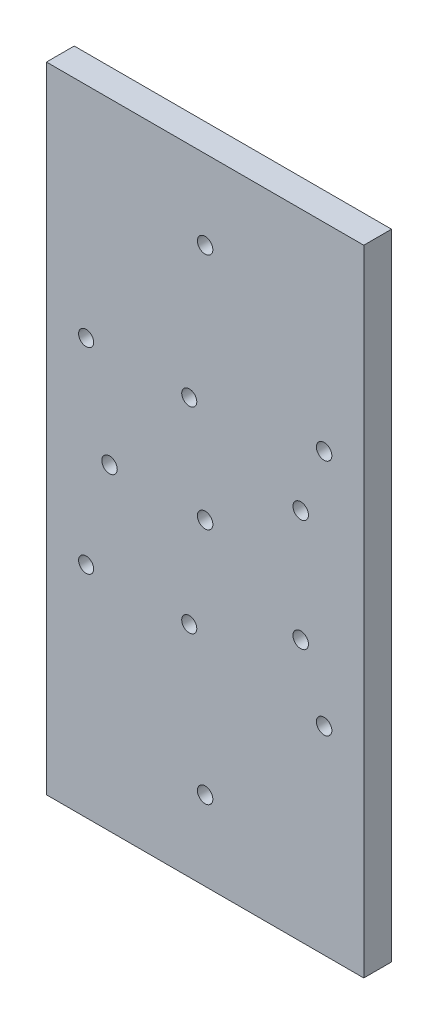
ISO-10303-21;
HEADER;
FILE_DESCRIPTION(('STEP AP214'),'2;1');
FILE_NAME('part.step','',(''),(''),'','','');
FILE_SCHEMA(('AUTOMOTIVE_DESIGN { 1 0 10303 214 1 1 1 1 }'));
ENDSEC;
DATA;
#1=APPLICATION_CONTEXT('core data for automotive mechanical design processes');
#2=APPLICATION_PROTOCOL_DEFINITION('international standard','automotive_design',2000,#1);
#3=PRODUCT_CONTEXT('',#1,'mechanical');
#4=PRODUCT('Part','Part','',(#3));
#5=PRODUCT_RELATED_PRODUCT_CATEGORY('part','',(#4));
#6=PRODUCT_DEFINITION_FORMATION('','',#4);
#7=PRODUCT_DEFINITION_CONTEXT('part definition',#1,'design');
#8=PRODUCT_DEFINITION('design','',#6,#7);
#9=PRODUCT_DEFINITION_SHAPE('','',#8);
#10=(LENGTH_UNIT() NAMED_UNIT(*) SI_UNIT(.MILLI.,.METRE.));
#11=(NAMED_UNIT(*) PLANE_ANGLE_UNIT() SI_UNIT($,.RADIAN.));
#12=(NAMED_UNIT(*) SI_UNIT($,.STERADIAN.) SOLID_ANGLE_UNIT());
#13=UNCERTAINTY_MEASURE_WITH_UNIT(LENGTH_MEASURE(1.E-05),#10,'distance_accuracy_value','');
#14=(GEOMETRIC_REPRESENTATION_CONTEXT(3) GLOBAL_UNCERTAINTY_ASSIGNED_CONTEXT((#13)) GLOBAL_UNIT_ASSIGNED_CONTEXT((#10,
#11,#12)) REPRESENTATION_CONTEXT('',''));
#15=CARTESIAN_POINT('',(0.,0.,0.));
#16=DIRECTION('',(0.,0.,1.));
#17=DIRECTION('',(1.,0.,0.));
#18=AXIS2_PLACEMENT_3D('',#15,#16,#17);
#19=CARTESIAN_POINT('',(40.,0.,7.));
#20=DIRECTION('',(-1.,0.,0.));
#21=DIRECTION('',(0.,0.,1.));
#22=AXIS2_PLACEMENT_3D('',#19,#20,#21);
#23=PLANE('',#22);
#24=DIRECTION('',(0.,1.,0.));
#25=VECTOR('',#24,1.);
#26=CARTESIAN_POINT('',(40.,0.,0.));
#27=LINE('',#26,#25);
#28=CARTESIAN_POINT('',(40.,-80.,0.));
#29=VERTEX_POINT('',#28);
#30=CARTESIAN_POINT('',(40.,80.,0.));
#31=VERTEX_POINT('',#30);
#32=EDGE_CURVE('E127',#29,#31,#27,.T.);
#33=ORIENTED_EDGE('',*,*,#32,.T.);
#34=DIRECTION('',(0.,0.,-1.));
#35=VECTOR('',#34,1.);
#36=CARTESIAN_POINT('',(40.,80.,7.));
#37=LINE('',#36,#35);
#38=CARTESIAN_POINT('',(40.,80.,7.));
#39=VERTEX_POINT('',#38);
#40=EDGE_CURVE('E11',#39,#31,#37,.T.);
#41=ORIENTED_EDGE('',*,*,#40,.F.);
#42=DIRECTION('',(0.,1.,0.));
#43=VECTOR('',#42,1.);
#44=CARTESIAN_POINT('',(40.,0.,7.));
#45=LINE('',#44,#43);
#46=CARTESIAN_POINT('',(40.,-80.,7.));
#47=VERTEX_POINT('',#46);
#48=EDGE_CURVE('E87',#47,#39,#45,.T.);
#49=ORIENTED_EDGE('',*,*,#48,.F.);
#50=DIRECTION('',(0.,0.,-1.));
#51=VECTOR('',#50,1.);
#52=CARTESIAN_POINT('',(40.,-80.,7.));
#53=LINE('',#52,#51);
#54=EDGE_CURVE('E107',#47,#29,#53,.T.);
#55=ORIENTED_EDGE('',*,*,#54,.T.);
#56=EDGE_LOOP('',(#33,#41,#49,#55));
#57=FACE_BOUND('',#56,.T.);
#58=ADVANCED_FACE('F45',(#57),#23,.F.);
#59=CARTESIAN_POINT('',(0.,80.,7.));
#60=DIRECTION('',(0.,1.,0.));
#61=DIRECTION('',(0.,0.,1.));
#62=AXIS2_PLACEMENT_3D('',#59,#60,#61);
#63=PLANE('',#62);
#64=DIRECTION('',(1.,0.,0.));
#65=VECTOR('',#64,1.);
#66=CARTESIAN_POINT('',(0.,80.,0.));
#67=LINE('',#66,#65);
#68=CARTESIAN_POINT('',(-40.,80.,0.));
#69=VERTEX_POINT('',#68);
#70=EDGE_CURVE('E96',#69,#31,#67,.T.);
#71=ORIENTED_EDGE('',*,*,#70,.F.);
#72=DIRECTION('',(0.,0.,-1.));
#73=VECTOR('',#72,1.);
#74=CARTESIAN_POINT('',(-40.,80.,7.));
#75=LINE('',#74,#73);
#76=CARTESIAN_POINT('',(-40.,80.,7.));
#77=VERTEX_POINT('',#76);
#78=EDGE_CURVE('E55',#77,#69,#75,.T.);
#79=ORIENTED_EDGE('',*,*,#78,.F.);
#80=DIRECTION('',(1.,0.,0.));
#81=VECTOR('',#80,1.);
#82=CARTESIAN_POINT('',(0.,80.,7.));
#83=LINE('',#82,#81);
#84=EDGE_CURVE('E94',#77,#39,#83,.T.);
#85=ORIENTED_EDGE('',*,*,#84,.T.);
#86=ORIENTED_EDGE('',*,*,#40,.T.);
#87=EDGE_LOOP('',(#71,#79,#85,#86));
#88=FACE_BOUND('',#87,.T.);
#89=ADVANCED_FACE('F93',(#88),#63,.T.);
#90=CARTESIAN_POINT('',(-40.,0.,7.));
#91=DIRECTION('',(-1.,0.,0.));
#92=DIRECTION('',(0.,0.,1.));
#93=AXIS2_PLACEMENT_3D('',#90,#91,#92);
#94=PLANE('',#93);
#95=DIRECTION('',(0.,1.,0.));
#96=VECTOR('',#95,1.);
#97=CARTESIAN_POINT('',(-40.,0.,0.));
#98=LINE('',#97,#96);
#99=CARTESIAN_POINT('',(-40.,-80.,0.));
#100=VERTEX_POINT('',#99);
#101=EDGE_CURVE('E131',#100,#69,#98,.T.);
#102=ORIENTED_EDGE('',*,*,#101,.F.);
#103=DIRECTION('',(0.,0.,-1.));
#104=VECTOR('',#103,1.);
#105=CARTESIAN_POINT('',(-40.,-80.,7.));
#106=LINE('',#105,#104);
#107=CARTESIAN_POINT('',(-40.,-80.,7.));
#108=VERTEX_POINT('',#107);
#109=EDGE_CURVE('E79',#108,#100,#106,.T.);
#110=ORIENTED_EDGE('',*,*,#109,.F.);
#111=DIRECTION('',(0.,1.,0.));
#112=VECTOR('',#111,1.);
#113=CARTESIAN_POINT('',(-40.,0.,7.));
#114=LINE('',#113,#112);
#115=EDGE_CURVE('E103',#108,#77,#114,.T.);
#116=ORIENTED_EDGE('',*,*,#115,.T.);
#117=ORIENTED_EDGE('',*,*,#78,.T.);
#118=EDGE_LOOP('',(#102,#110,#116,#117));
#119=FACE_BOUND('',#118,.T.);
#120=ADVANCED_FACE('F105',(#119),#94,.T.);
#121=CARTESIAN_POINT('',(0.,60.,7.));
#122=DIRECTION('',(0.,0.,-1.));
#123=DIRECTION('',(-1.,0.,0.));
#124=AXIS2_PLACEMENT_3D('',#121,#122,#123);
#125=CYLINDRICAL_SURFACE('',#124,1.95);
#126=CARTESIAN_POINT('',(0.,60.,7.));
#127=DIRECTION('',(0.,0.,1.));
#128=DIRECTION('',(1.,0.,0.));
#129=AXIS2_PLACEMENT_3D('',#126,#127,#128);
#130=CIRCLE('',#129,1.95);
#131=CARTESIAN_POINT('',(1.95000000000006,60.,7.));
#132=VERTEX_POINT('',#131);
#133=EDGE_CURVE('E187',#132,#132,#130,.T.);
#134=ORIENTED_EDGE('',*,*,#133,.T.);
#135=EDGE_LOOP('',(#134));
#136=FACE_BOUND('',#135,.T.);
#137=CARTESIAN_POINT('',(0.,60.,0.));
#138=DIRECTION('',(0.,0.,1.));
#139=DIRECTION('',(1.,0.,0.));
#140=AXIS2_PLACEMENT_3D('',#137,#138,#139);
#141=CIRCLE('',#140,1.95);
#142=CARTESIAN_POINT('',(1.95000000000006,60.,0.));
#143=VERTEX_POINT('',#142);
#144=EDGE_CURVE('E124',#143,#143,#141,.T.);
#145=ORIENTED_EDGE('',*,*,#144,.F.);
#146=EDGE_LOOP('',(#145));
#147=FACE_BOUND('',#146,.T.);
#148=ADVANCED_FACE('F191',(#136,#147),#125,.F.);
#149=CARTESIAN_POINT('',(0.,0.,7.));
#150=DIRECTION('',(0.,0.,-1.));
#151=DIRECTION('',(-1.,0.,0.));
#152=AXIS2_PLACEMENT_3D('',#149,#150,#151);
#153=CYLINDRICAL_SURFACE('',#152,1.95);
#154=CARTESIAN_POINT('',(0.,0.,7.));
#155=DIRECTION('',(0.,0.,1.));
#156=DIRECTION('',(1.,0.,0.));
#157=AXIS2_PLACEMENT_3D('',#154,#155,#156);
#158=CIRCLE('',#157,1.95);
#159=CARTESIAN_POINT('',(1.95000000000006,0.,7.));
#160=VERTEX_POINT('',#159);
#161=EDGE_CURVE('E184',#160,#160,#158,.T.);
#162=ORIENTED_EDGE('',*,*,#161,.T.);
#163=EDGE_LOOP('',(#162));
#164=FACE_BOUND('',#163,.T.);
#165=CARTESIAN_POINT('',(0.,0.,0.));
#166=DIRECTION('',(0.,0.,1.));
#167=DIRECTION('',(1.,0.,0.));
#168=AXIS2_PLACEMENT_3D('',#165,#166,#167);
#169=CIRCLE('',#168,1.95);
#170=CARTESIAN_POINT('',(1.95000000000006,0.,0.));
#171=VERTEX_POINT('',#170);
#172=EDGE_CURVE('E121',#171,#171,#169,.T.);
#173=ORIENTED_EDGE('',*,*,#172,.F.);
#174=EDGE_LOOP('',(#173));
#175=FACE_BOUND('',#174,.T.);
#176=ADVANCED_FACE('F221',(#164,#175),#153,.F.);
#177=CARTESIAN_POINT('',(0.,-60.,7.));
#178=DIRECTION('',(0.,0.,-1.));
#179=DIRECTION('',(-1.,0.,0.));
#180=AXIS2_PLACEMENT_3D('',#177,#178,#179);
#181=CYLINDRICAL_SURFACE('',#180,1.95);
#182=CARTESIAN_POINT('',(0.,-60.,7.));
#183=DIRECTION('',(0.,0.,1.));
#184=DIRECTION('',(1.,0.,0.));
#185=AXIS2_PLACEMENT_3D('',#182,#183,#184);
#186=CIRCLE('',#185,1.95);
#187=CARTESIAN_POINT('',(1.95000000000007,-60.,7.));
#188=VERTEX_POINT('',#187);
#189=EDGE_CURVE('E181',#188,#188,#186,.T.);
#190=ORIENTED_EDGE('',*,*,#189,.T.);
#191=EDGE_LOOP('',(#190));
#192=FACE_BOUND('',#191,.T.);
#193=CARTESIAN_POINT('',(0.,-60.,0.));
#194=DIRECTION('',(0.,0.,1.));
#195=DIRECTION('',(1.,0.,0.));
#196=AXIS2_PLACEMENT_3D('',#193,#194,#195);
#197=CIRCLE('',#196,1.95);
#198=CARTESIAN_POINT('',(1.95000000000007,-60.,0.));
#199=VERTEX_POINT('',#198);
#200=EDGE_CURVE('E118',#199,#199,#197,.T.);
#201=ORIENTED_EDGE('',*,*,#200,.F.);
#202=EDGE_LOOP('',(#201));
#203=FACE_BOUND('',#202,.T.);
#204=ADVANCED_FACE('F224',(#192,#203),#181,.F.);
#205=CARTESIAN_POINT('',(30.0000000000001,30.,7.));
#206=DIRECTION('',(0.,0.,-1.));
#207=DIRECTION('',(-1.,0.,0.));
#208=AXIS2_PLACEMENT_3D('',#205,#206,#207);
#209=CYLINDRICAL_SURFACE('',#208,1.94999999999999);
#210=CARTESIAN_POINT('',(30.0000000000001,30.,7.));
#211=DIRECTION('',(0.,0.,1.));
#212=DIRECTION('',(1.,0.,0.));
#213=AXIS2_PLACEMENT_3D('',#210,#211,#212);
#214=CIRCLE('',#213,1.94999999999999);
#215=CARTESIAN_POINT('',(31.9500000000001,30.,7.));
#216=VERTEX_POINT('',#215);
#217=EDGE_CURVE('E178',#216,#216,#214,.T.);
#218=ORIENTED_EDGE('',*,*,#217,.T.);
#219=EDGE_LOOP('',(#218));
#220=FACE_BOUND('',#219,.T.);
#221=CARTESIAN_POINT('',(30.0000000000001,30.,0.));
#222=DIRECTION('',(0.,0.,1.));
#223=DIRECTION('',(1.,0.,0.));
#224=AXIS2_PLACEMENT_3D('',#221,#222,#223);
#225=CIRCLE('',#224,1.94999999999999);
#226=CARTESIAN_POINT('',(31.9500000000001,30.,0.));
#227=VERTEX_POINT('',#226);
#228=EDGE_CURVE('E114',#227,#227,#225,.T.);
#229=ORIENTED_EDGE('',*,*,#228,.F.);
#230=EDGE_LOOP('',(#229));
#231=FACE_BOUND('',#230,.T.);
#232=ADVANCED_FACE('F227',(#220,#231),#209,.F.);
#233=CARTESIAN_POINT('',(30.0000000000001,-30.,7.));
#234=DIRECTION('',(0.,0.,-1.));
#235=DIRECTION('',(-1.,0.,0.));
#236=AXIS2_PLACEMENT_3D('',#233,#234,#235);
#237=CYLINDRICAL_SURFACE('',#236,1.94999999999999);
#238=CARTESIAN_POINT('',(30.0000000000001,-30.,7.));
#239=DIRECTION('',(0.,0.,1.));
#240=DIRECTION('',(1.,0.,0.));
#241=AXIS2_PLACEMENT_3D('',#238,#239,#240);
#242=CIRCLE('',#241,1.94999999999999);
#243=CARTESIAN_POINT('',(31.9500000000001,-30.,7.));
#244=VERTEX_POINT('',#243);
#245=EDGE_CURVE('E134',#244,#244,#242,.T.);
#246=ORIENTED_EDGE('',*,*,#245,.T.);
#247=EDGE_LOOP('',(#246));
#248=FACE_BOUND('',#247,.T.);
#249=CARTESIAN_POINT('',(30.0000000000001,-30.,0.));
#250=DIRECTION('',(0.,0.,1.));
#251=DIRECTION('',(1.,0.,0.));
#252=AXIS2_PLACEMENT_3D('',#249,#250,#251);
#253=CIRCLE('',#252,1.94999999999999);
#254=CARTESIAN_POINT('',(31.9500000000001,-30.,0.));
#255=VERTEX_POINT('',#254);
#256=EDGE_CURVE('E111',#255,#255,#253,.T.);
#257=ORIENTED_EDGE('',*,*,#256,.F.);
#258=EDGE_LOOP('',(#257));
#259=FACE_BOUND('',#258,.T.);
#260=ADVANCED_FACE('F47',(#248,#259),#237,.F.);
#261=CARTESIAN_POINT('',(0.,-80.,7.));
#262=DIRECTION('',(0.,1.,0.));
#263=DIRECTION('',(0.,0.,1.));
#264=AXIS2_PLACEMENT_3D('',#261,#262,#263);
#265=PLANE('',#264);
#266=DIRECTION('',(1.,0.,0.));
#267=VECTOR('',#266,1.);
#268=CARTESIAN_POINT('',(0.,-80.,0.));
#269=LINE('',#268,#267);
#270=EDGE_CURVE('E82',#100,#29,#269,.T.);
#271=ORIENTED_EDGE('',*,*,#270,.T.);
#272=ORIENTED_EDGE('',*,*,#54,.F.);
#273=DIRECTION('',(1.,0.,0.));
#274=VECTOR('',#273,1.);
#275=CARTESIAN_POINT('',(0.,-80.,7.));
#276=LINE('',#275,#274);
#277=EDGE_CURVE('E64',#108,#47,#276,.T.);
#278=ORIENTED_EDGE('',*,*,#277,.F.);
#279=ORIENTED_EDGE('',*,*,#109,.T.);
#280=EDGE_LOOP('',(#271,#272,#278,#279));
#281=FACE_BOUND('',#280,.T.);
#282=ADVANCED_FACE('F196',(#281),#265,.F.);
#283=CARTESIAN_POINT('',(0.,0.,7.));
#284=DIRECTION('',(0.,0.,1.));
#285=DIRECTION('',(1.,0.,0.));
#286=AXIS2_PLACEMENT_3D('',#283,#284,#285);
#287=PLANE('',#286);
#288=CARTESIAN_POINT('',(-24.1,0.,7.));
#289=DIRECTION('',(0.,0.,1.));
#290=DIRECTION('',(1.,0.,0.));
#291=AXIS2_PLACEMENT_3D('',#288,#289,#290);
#292=CIRCLE('',#291,1.95);
#293=CARTESIAN_POINT('',(-22.15,0.,7.));
#294=VERTEX_POINT('',#293);
#295=EDGE_CURVE('E152',#294,#294,#292,.T.);
#296=ORIENTED_EDGE('',*,*,#295,.F.);
#297=EDGE_LOOP('',(#296));
#298=FACE_BOUND('',#297,.T.);
#299=CARTESIAN_POINT('',(24.1,-14.1,7.));
#300=DIRECTION('',(0.,0.,1.));
#301=DIRECTION('',(1.,0.,0.));
#302=AXIS2_PLACEMENT_3D('',#299,#300,#301);
#303=CIRCLE('',#302,1.95);
#304=CARTESIAN_POINT('',(26.05,-14.1,7.));
#305=VERTEX_POINT('',#304);
#306=EDGE_CURVE('E336',#305,#305,#303,.T.);
#307=ORIENTED_EDGE('',*,*,#306,.F.);
#308=EDGE_LOOP('',(#307));
#309=FACE_BOUND('',#308,.T.);
#310=CARTESIAN_POINT('',(24.1,14.1,7.));
#311=DIRECTION('',(0.,0.,1.));
#312=DIRECTION('',(1.,0.,0.));
#313=AXIS2_PLACEMENT_3D('',#310,#311,#312);
#314=CIRCLE('',#313,1.95);
#315=CARTESIAN_POINT('',(26.05,14.1,7.));
#316=VERTEX_POINT('',#315);
#317=EDGE_CURVE('E170',#316,#316,#314,.T.);
#318=ORIENTED_EDGE('',*,*,#317,.F.);
#319=EDGE_LOOP('',(#318));
#320=FACE_BOUND('',#319,.T.);
#321=CARTESIAN_POINT('',(-4.,24.75,7.));
#322=DIRECTION('',(0.,0.,1.));
#323=DIRECTION('',(1.,0.,0.));
#324=AXIS2_PLACEMENT_3D('',#321,#322,#323);
#325=CIRCLE('',#324,1.9);
#326=CARTESIAN_POINT('',(-2.10000000000001,24.75,7.));
#327=VERTEX_POINT('',#326);
#328=EDGE_CURVE('E166',#327,#327,#325,.T.);
#329=ORIENTED_EDGE('',*,*,#328,.F.);
#330=EDGE_LOOP('',(#329));
#331=FACE_BOUND('',#330,.T.);
#332=CARTESIAN_POINT('',(-30.,-24.75,7.));
#333=DIRECTION('',(0.,0.,1.));
#334=DIRECTION('',(1.,0.,0.));
#335=AXIS2_PLACEMENT_3D('',#332,#333,#334);
#336=CIRCLE('',#335,1.9);
#337=CARTESIAN_POINT('',(-28.1,-24.75,7.));
#338=VERTEX_POINT('',#337);
#339=EDGE_CURVE('E161',#338,#338,#336,.T.);
#340=ORIENTED_EDGE('',*,*,#339,.F.);
#341=EDGE_LOOP('',(#340));
#342=FACE_BOUND('',#341,.T.);
#343=CARTESIAN_POINT('',(-4.,-24.75,7.));
#344=DIRECTION('',(0.,0.,1.));
#345=DIRECTION('',(1.,0.,0.));
#346=AXIS2_PLACEMENT_3D('',#343,#344,#345);
#347=CIRCLE('',#346,1.9);
#348=CARTESIAN_POINT('',(-2.10000000000001,-24.75,7.));
#349=VERTEX_POINT('',#348);
#350=EDGE_CURVE('E157',#349,#349,#347,.T.);
#351=ORIENTED_EDGE('',*,*,#350,.F.);
#352=EDGE_LOOP('',(#351));
#353=FACE_BOUND('',#352,.T.);
#354=CARTESIAN_POINT('',(-30.,24.75,7.));
#355=DIRECTION('',(0.,0.,1.));
#356=DIRECTION('',(1.,0.,0.));
#357=AXIS2_PLACEMENT_3D('',#354,#355,#356);
#358=CIRCLE('',#357,1.9);
#359=CARTESIAN_POINT('',(-28.1,24.75,7.));
#360=VERTEX_POINT('',#359);
#361=EDGE_CURVE('E141',#360,#360,#358,.T.);
#362=ORIENTED_EDGE('',*,*,#361,.F.);
#363=EDGE_LOOP('',(#362));
#364=FACE_BOUND('',#363,.T.);
#365=ORIENTED_EDGE('',*,*,#245,.F.);
#366=EDGE_LOOP('',(#365));
#367=FACE_BOUND('',#366,.T.);
#368=ORIENTED_EDGE('',*,*,#217,.F.);
#369=EDGE_LOOP('',(#368));
#370=FACE_BOUND('',#369,.T.);
#371=ORIENTED_EDGE('',*,*,#189,.F.);
#372=EDGE_LOOP('',(#371));
#373=FACE_BOUND('',#372,.T.);
#374=ORIENTED_EDGE('',*,*,#161,.F.);
#375=EDGE_LOOP('',(#374));
#376=FACE_BOUND('',#375,.T.);
#377=ORIENTED_EDGE('',*,*,#133,.F.);
#378=EDGE_LOOP('',(#377));
#379=FACE_BOUND('',#378,.T.);
#380=ORIENTED_EDGE('',*,*,#48,.T.);
#381=ORIENTED_EDGE('',*,*,#84,.F.);
#382=ORIENTED_EDGE('',*,*,#115,.F.);
#383=ORIENTED_EDGE('',*,*,#277,.T.);
#384=EDGE_LOOP('',(#380,#381,#382,#383));
#385=FACE_BOUND('',#384,.T.);
#386=ADVANCED_FACE('F102',(#298,#309,#320,#331,#342,#353,#364,#367,#370,#373,#376,#379,#385),
#287,.T.);
#387=CARTESIAN_POINT('',(0.,0.,0.));
#388=DIRECTION('',(0.,0.,1.));
#389=DIRECTION('',(1.,0.,0.));
#390=AXIS2_PLACEMENT_3D('',#387,#388,#389);
#391=PLANE('',#390);
#392=CARTESIAN_POINT('',(-24.1,0.,0.));
#393=DIRECTION('',(0.,0.,1.));
#394=DIRECTION('',(1.,0.,0.));
#395=AXIS2_PLACEMENT_3D('',#392,#393,#394);
#396=CIRCLE('',#395,1.95);
#397=CARTESIAN_POINT('',(-22.15,0.,0.));
#398=VERTEX_POINT('',#397);
#399=EDGE_CURVE('E49',#398,#398,#396,.T.);
#400=ORIENTED_EDGE('',*,*,#399,.T.);
#401=EDGE_LOOP('',(#400));
#402=FACE_BOUND('',#401,.T.);
#403=CARTESIAN_POINT('',(24.1,-14.1,0.));
#404=DIRECTION('',(0.,0.,1.));
#405=DIRECTION('',(1.,0.,0.));
#406=AXIS2_PLACEMENT_3D('',#403,#404,#405);
#407=CIRCLE('',#406,1.95);
#408=CARTESIAN_POINT('',(26.05,-14.1,0.));
#409=VERTEX_POINT('',#408);
#410=EDGE_CURVE('E151',#409,#409,#407,.T.);
#411=ORIENTED_EDGE('',*,*,#410,.T.);
#412=EDGE_LOOP('',(#411));
#413=FACE_BOUND('',#412,.T.);
#414=CARTESIAN_POINT('',(24.1,14.1,0.));
#415=DIRECTION('',(0.,0.,1.));
#416=DIRECTION('',(1.,0.,0.));
#417=AXIS2_PLACEMENT_3D('',#414,#415,#416);
#418=CIRCLE('',#417,1.95);
#419=CARTESIAN_POINT('',(26.05,14.1,0.));
#420=VERTEX_POINT('',#419);
#421=EDGE_CURVE('E149',#420,#420,#418,.T.);
#422=ORIENTED_EDGE('',*,*,#421,.T.);
#423=EDGE_LOOP('',(#422));
#424=FACE_BOUND('',#423,.T.);
#425=CARTESIAN_POINT('',(-4.,24.75,0.));
#426=DIRECTION('',(0.,0.,1.));
#427=DIRECTION('',(1.,0.,0.));
#428=AXIS2_PLACEMENT_3D('',#425,#426,#427);
#429=CIRCLE('',#428,1.9);
#430=CARTESIAN_POINT('',(-2.10000000000001,24.75,0.));
#431=VERTEX_POINT('',#430);
#432=EDGE_CURVE('E115',#431,#431,#429,.T.);
#433=ORIENTED_EDGE('',*,*,#432,.T.);
#434=EDGE_LOOP('',(#433));
#435=FACE_BOUND('',#434,.T.);
#436=CARTESIAN_POINT('',(-30.,-24.75,0.));
#437=DIRECTION('',(0.,0.,1.));
#438=DIRECTION('',(1.,0.,0.));
#439=AXIS2_PLACEMENT_3D('',#436,#437,#438);
#440=CIRCLE('',#439,1.9);
#441=CARTESIAN_POINT('',(-28.1,-24.75,0.));
#442=VERTEX_POINT('',#441);
#443=EDGE_CURVE('E144',#442,#442,#440,.T.);
#444=ORIENTED_EDGE('',*,*,#443,.T.);
#445=EDGE_LOOP('',(#444));
#446=FACE_BOUND('',#445,.T.);
#447=CARTESIAN_POINT('',(-4.,-24.75,0.));
#448=DIRECTION('',(0.,0.,1.));
#449=DIRECTION('',(1.,0.,0.));
#450=AXIS2_PLACEMENT_3D('',#447,#448,#449);
#451=CIRCLE('',#450,1.9);
#452=CARTESIAN_POINT('',(-2.10000000000001,-24.75,0.));
#453=VERTEX_POINT('',#452);
#454=EDGE_CURVE('E140',#453,#453,#451,.T.);
#455=ORIENTED_EDGE('',*,*,#454,.T.);
#456=EDGE_LOOP('',(#455));
#457=FACE_BOUND('',#456,.T.);
#458=CARTESIAN_POINT('',(-30.,24.75,0.));
#459=DIRECTION('',(0.,0.,1.));
#460=DIRECTION('',(1.,0.,0.));
#461=AXIS2_PLACEMENT_3D('',#458,#459,#460);
#462=CIRCLE('',#461,1.9);
#463=CARTESIAN_POINT('',(-28.1,24.75,0.));
#464=VERTEX_POINT('',#463);
#465=EDGE_CURVE('E137',#464,#464,#462,.T.);
#466=ORIENTED_EDGE('',*,*,#465,.T.);
#467=EDGE_LOOP('',(#466));
#468=FACE_BOUND('',#467,.T.);
#469=ORIENTED_EDGE('',*,*,#256,.T.);
#470=EDGE_LOOP('',(#469));
#471=FACE_BOUND('',#470,.T.);
#472=ORIENTED_EDGE('',*,*,#228,.T.);
#473=EDGE_LOOP('',(#472));
#474=FACE_BOUND('',#473,.T.);
#475=ORIENTED_EDGE('',*,*,#200,.T.);
#476=EDGE_LOOP('',(#475));
#477=FACE_BOUND('',#476,.T.);
#478=ORIENTED_EDGE('',*,*,#172,.T.);
#479=EDGE_LOOP('',(#478));
#480=FACE_BOUND('',#479,.T.);
#481=ORIENTED_EDGE('',*,*,#144,.T.);
#482=EDGE_LOOP('',(#481));
#483=FACE_BOUND('',#482,.T.);
#484=ORIENTED_EDGE('',*,*,#32,.F.);
#485=ORIENTED_EDGE('',*,*,#270,.F.);
#486=ORIENTED_EDGE('',*,*,#101,.T.);
#487=ORIENTED_EDGE('',*,*,#70,.T.);
#488=EDGE_LOOP('',(#484,#485,#486,#487));
#489=FACE_BOUND('',#488,.T.);
#490=ADVANCED_FACE('F195',(#402,#413,#424,#435,#446,#457,#468,#471,#474,#477,#480,#483,#489),
#391,.F.);
#491=CARTESIAN_POINT('',(-30.,24.75,-3.));
#492=DIRECTION('',(0.,0.,1.));
#493=DIRECTION('',(1.,0.,0.));
#494=AXIS2_PLACEMENT_3D('',#491,#492,#493);
#495=CYLINDRICAL_SURFACE('',#494,1.9);
#496=ORIENTED_EDGE('',*,*,#361,.T.);
#497=EDGE_LOOP('',(#496));
#498=FACE_BOUND('',#497,.T.);
#499=ORIENTED_EDGE('',*,*,#465,.F.);
#500=EDGE_LOOP('',(#499));
#501=FACE_BOUND('',#500,.T.);
#502=ADVANCED_FACE('F203',(#498,#501),#495,.F.);
#503=CARTESIAN_POINT('',(-4.,-24.75,-3.));
#504=DIRECTION('',(0.,0.,1.));
#505=DIRECTION('',(1.,0.,0.));
#506=AXIS2_PLACEMENT_3D('',#503,#504,#505);
#507=CYLINDRICAL_SURFACE('',#506,1.9);
#508=ORIENTED_EDGE('',*,*,#350,.T.);
#509=EDGE_LOOP('',(#508));
#510=FACE_BOUND('',#509,.T.);
#511=ORIENTED_EDGE('',*,*,#454,.F.);
#512=EDGE_LOOP('',(#511));
#513=FACE_BOUND('',#512,.T.);
#514=ADVANCED_FACE('F274',(#510,#513),#507,.F.);
#515=CARTESIAN_POINT('',(-30.,-24.75,-3.));
#516=DIRECTION('',(0.,0.,1.));
#517=DIRECTION('',(1.,0.,0.));
#518=AXIS2_PLACEMENT_3D('',#515,#516,#517);
#519=CYLINDRICAL_SURFACE('',#518,1.9);
#520=ORIENTED_EDGE('',*,*,#339,.T.);
#521=EDGE_LOOP('',(#520));
#522=FACE_BOUND('',#521,.T.);
#523=ORIENTED_EDGE('',*,*,#443,.F.);
#524=EDGE_LOOP('',(#523));
#525=FACE_BOUND('',#524,.T.);
#526=ADVANCED_FACE('F283',(#522,#525),#519,.F.);
#527=CARTESIAN_POINT('',(-4.,24.75,-3.));
#528=DIRECTION('',(0.,0.,1.));
#529=DIRECTION('',(1.,0.,0.));
#530=AXIS2_PLACEMENT_3D('',#527,#528,#529);
#531=CYLINDRICAL_SURFACE('',#530,1.9);
#532=ORIENTED_EDGE('',*,*,#328,.T.);
#533=EDGE_LOOP('',(#532));
#534=FACE_BOUND('',#533,.T.);
#535=ORIENTED_EDGE('',*,*,#432,.F.);
#536=EDGE_LOOP('',(#535));
#537=FACE_BOUND('',#536,.T.);
#538=ADVANCED_FACE('F290',(#534,#537),#531,.F.);
#539=CARTESIAN_POINT('',(24.1,14.1,-3.));
#540=DIRECTION('',(0.,0.,1.));
#541=DIRECTION('',(1.,0.,0.));
#542=AXIS2_PLACEMENT_3D('',#539,#540,#541);
#543=CYLINDRICAL_SURFACE('',#542,1.95);
#544=ORIENTED_EDGE('',*,*,#317,.T.);
#545=EDGE_LOOP('',(#544));
#546=FACE_BOUND('',#545,.T.);
#547=ORIENTED_EDGE('',*,*,#421,.F.);
#548=EDGE_LOOP('',(#547));
#549=FACE_BOUND('',#548,.T.);
#550=ADVANCED_FACE('F298',(#546,#549),#543,.F.);
#551=CARTESIAN_POINT('',(24.1,-14.1,-3.));
#552=DIRECTION('',(0.,0.,1.));
#553=DIRECTION('',(1.,0.,0.));
#554=AXIS2_PLACEMENT_3D('',#551,#552,#553);
#555=CYLINDRICAL_SURFACE('',#554,1.95);
#556=ORIENTED_EDGE('',*,*,#306,.T.);
#557=EDGE_LOOP('',(#556));
#558=FACE_BOUND('',#557,.T.);
#559=ORIENTED_EDGE('',*,*,#410,.F.);
#560=EDGE_LOOP('',(#559));
#561=FACE_BOUND('',#560,.T.);
#562=ADVANCED_FACE('F311',(#558,#561),#555,.F.);
#563=CARTESIAN_POINT('',(-24.1,0.,-3.));
#564=DIRECTION('',(0.,0.,1.));
#565=DIRECTION('',(1.,0.,0.));
#566=AXIS2_PLACEMENT_3D('',#563,#564,#565);
#567=CYLINDRICAL_SURFACE('',#566,1.95);
#568=ORIENTED_EDGE('',*,*,#295,.T.);
#569=EDGE_LOOP('',(#568));
#570=FACE_BOUND('',#569,.T.);
#571=ORIENTED_EDGE('',*,*,#399,.F.);
#572=EDGE_LOOP('',(#571));
#573=FACE_BOUND('',#572,.T.);
#574=ADVANCED_FACE('F321',(#570,#573),#567,.F.);
#575=CLOSED_SHELL('',(#58,#89,#120,#148,#176,#204,#232,#260,#282,#386,#490,#502,#514,#526,#538,
#550,#562,#574));
#576=MANIFOLD_SOLID_BREP('B2',#575);
#577=ADVANCED_BREP_SHAPE_REPRESENTATION('',(#18,#576),#14);
#578=SHAPE_DEFINITION_REPRESENTATION(#9,#577);
ENDSEC;
END-ISO-10303-21;
